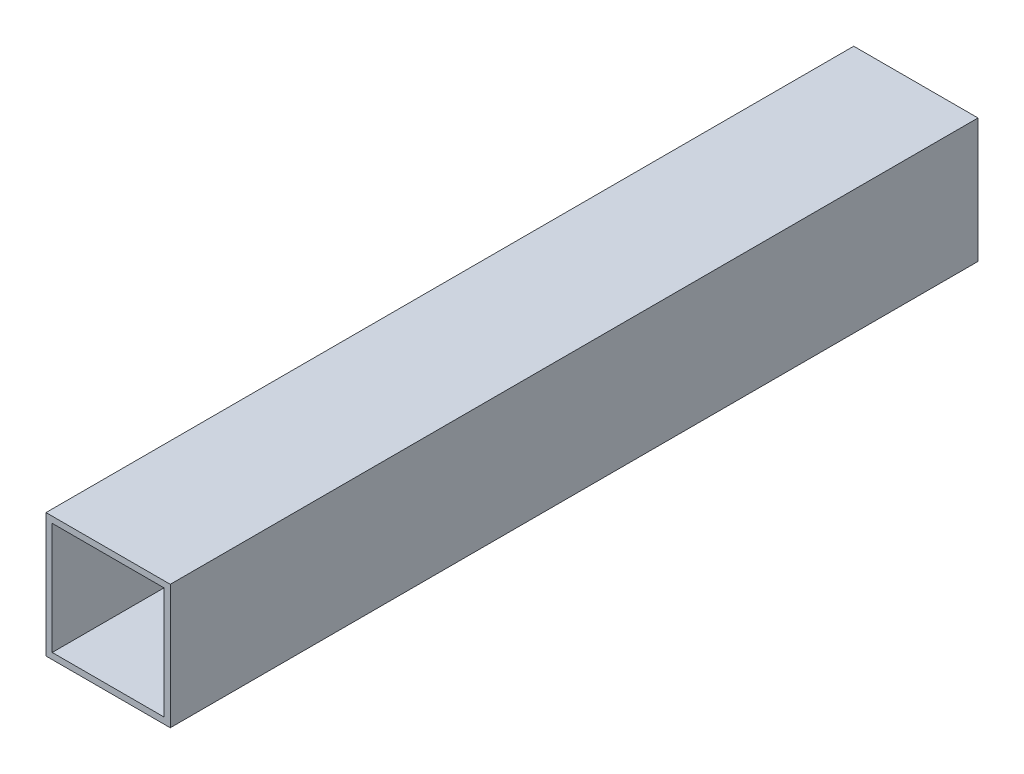
ISO-10303-21;
HEADER;
FILE_DESCRIPTION(('STEP AP214'),'2;1');
FILE_NAME('part.step','',(''),(''),'','','');
FILE_SCHEMA(('AUTOMOTIVE_DESIGN { 1 0 10303 214 1 1 1 1 }'));
ENDSEC;
DATA;
#1=APPLICATION_CONTEXT('core data for automotive mechanical design processes');
#2=APPLICATION_PROTOCOL_DEFINITION('international standard','automotive_design',2000,#1);
#3=PRODUCT_CONTEXT('',#1,'mechanical');
#4=PRODUCT('Part','Part','',(#3));
#5=PRODUCT_RELATED_PRODUCT_CATEGORY('part','',(#4));
#6=PRODUCT_DEFINITION_FORMATION('','',#4);
#7=PRODUCT_DEFINITION_CONTEXT('part definition',#1,'design');
#8=PRODUCT_DEFINITION('design','',#6,#7);
#9=PRODUCT_DEFINITION_SHAPE('','',#8);
#10=(LENGTH_UNIT() NAMED_UNIT(*) SI_UNIT(.MILLI.,.METRE.));
#11=(NAMED_UNIT(*) PLANE_ANGLE_UNIT() SI_UNIT($,.RADIAN.));
#12=(NAMED_UNIT(*) SI_UNIT($,.STERADIAN.) SOLID_ANGLE_UNIT());
#13=UNCERTAINTY_MEASURE_WITH_UNIT(LENGTH_MEASURE(1.E-05),#10,'distance_accuracy_value','');
#14=(GEOMETRIC_REPRESENTATION_CONTEXT(3) GLOBAL_UNCERTAINTY_ASSIGNED_CONTEXT((#13)) GLOBAL_UNIT_ASSIGNED_CONTEXT((#10,
#11,#12)) REPRESENTATION_CONTEXT('',''));
#15=CARTESIAN_POINT('',(0.,0.,0.));
#16=DIRECTION('',(0.,0.,1.));
#17=DIRECTION('',(1.,0.,0.));
#18=AXIS2_PLACEMENT_3D('',#15,#16,#17);
#19=CARTESIAN_POINT('',(0.,0.,325.));
#20=DIRECTION('',(0.,0.,-1.));
#21=DIRECTION('',(-1.,0.,0.));
#22=AXIS2_PLACEMENT_3D('',#19,#20,#21);
#23=PLANE('',#22);
#24=DIRECTION('',(0.,-1.,0.));
#25=VECTOR('',#24,1.);
#26=CARTESIAN_POINT('',(-50.,-50.,325.));
#27=LINE('',#26,#25);
#28=CARTESIAN_POINT('',(-50.,49.9999999999999,325.));
#29=VERTEX_POINT('',#28);
#30=CARTESIAN_POINT('',(-50.,-50.,325.));
#31=VERTEX_POINT('',#30);
#32=EDGE_CURVE('E133',#29,#31,#27,.T.);
#33=ORIENTED_EDGE('',*,*,#32,.T.);
#34=DIRECTION('',(1.,0.,0.));
#35=VECTOR('',#34,1.);
#36=CARTESIAN_POINT('',(-50.,-50.,325.));
#37=LINE('',#36,#35);
#38=CARTESIAN_POINT('',(50.,-50.,325.));
#39=VERTEX_POINT('',#38);
#40=EDGE_CURVE('E136',#31,#39,#37,.T.);
#41=ORIENTED_EDGE('',*,*,#40,.T.);
#42=DIRECTION('',(0.,1.,0.));
#43=VECTOR('',#42,1.);
#44=CARTESIAN_POINT('',(50.,-50.,325.));
#45=LINE('',#44,#43);
#46=CARTESIAN_POINT('',(49.9999999999999,49.9999999999999,325.));
#47=VERTEX_POINT('',#46);
#48=EDGE_CURVE('E139',#39,#47,#45,.T.);
#49=ORIENTED_EDGE('',*,*,#48,.T.);
#50=DIRECTION('',(-1.,0.,0.));
#51=VECTOR('',#50,1.);
#52=CARTESIAN_POINT('',(-50.,49.9999999999999,325.));
#53=LINE('',#52,#51);
#54=EDGE_CURVE('E141',#47,#29,#53,.T.);
#55=ORIENTED_EDGE('',*,*,#54,.T.);
#56=EDGE_LOOP('',(#33,#41,#49,#55));
#57=FACE_BOUND('',#56,.T.);
#58=DIRECTION('',(0.,-1.,0.));
#59=VECTOR('',#58,1.);
#60=CARTESIAN_POINT('',(-45.,-45.,325.));
#61=LINE('',#60,#59);
#62=CARTESIAN_POINT('',(-45.,44.9999999999999,325.));
#63=VERTEX_POINT('',#62);
#64=CARTESIAN_POINT('',(-45.,-45.,325.));
#65=VERTEX_POINT('',#64);
#66=EDGE_CURVE('E97',#63,#65,#61,.T.);
#67=ORIENTED_EDGE('',*,*,#66,.F.);
#68=DIRECTION('',(-1.,0.,0.));
#69=VECTOR('',#68,1.);
#70=CARTESIAN_POINT('',(-45.,44.9999999999999,325.));
#71=LINE('',#70,#69);
#72=CARTESIAN_POINT('',(45.,44.9999999999999,325.));
#73=VERTEX_POINT('',#72);
#74=EDGE_CURVE('E119',#73,#63,#71,.T.);
#75=ORIENTED_EDGE('',*,*,#74,.F.);
#76=DIRECTION('',(0.,1.,0.));
#77=VECTOR('',#76,1.);
#78=CARTESIAN_POINT('',(45.,-45.,325.));
#79=LINE('',#78,#77);
#80=CARTESIAN_POINT('',(45.,-45.,325.));
#81=VERTEX_POINT('',#80);
#82=EDGE_CURVE('E117',#81,#73,#79,.T.);
#83=ORIENTED_EDGE('',*,*,#82,.F.);
#84=DIRECTION('',(1.,0.,0.));
#85=VECTOR('',#84,1.);
#86=CARTESIAN_POINT('',(-45.,-45.,325.));
#87=LINE('',#86,#85);
#88=EDGE_CURVE('E105',#65,#81,#87,.T.);
#89=ORIENTED_EDGE('',*,*,#88,.F.);
#90=EDGE_LOOP('',(#67,#75,#83,#89));
#91=FACE_BOUND('',#90,.T.);
#92=ADVANCED_FACE('F32',(#57,#91),#23,.F.);
#93=CARTESIAN_POINT('',(0.,0.,-325.));
#94=DIRECTION('',(0.,0.,-1.));
#95=DIRECTION('',(-1.,0.,0.));
#96=AXIS2_PLACEMENT_3D('',#93,#94,#95);
#97=PLANE('',#96);
#98=DIRECTION('',(0.,-1.,0.));
#99=VECTOR('',#98,1.);
#100=CARTESIAN_POINT('',(-50.,-50.,-325.));
#101=LINE('',#100,#99);
#102=CARTESIAN_POINT('',(-50.,49.9999999999999,-325.));
#103=VERTEX_POINT('',#102);
#104=CARTESIAN_POINT('',(-50.,-50.,-325.));
#105=VERTEX_POINT('',#104);
#106=EDGE_CURVE('E113',#103,#105,#101,.T.);
#107=ORIENTED_EDGE('',*,*,#106,.F.);
#108=DIRECTION('',(-1.,0.,0.));
#109=VECTOR('',#108,1.);
#110=CARTESIAN_POINT('',(-50.,49.9999999999999,-325.));
#111=LINE('',#110,#109);
#112=CARTESIAN_POINT('',(49.9999999999999,49.9999999999999,-325.));
#113=VERTEX_POINT('',#112);
#114=EDGE_CURVE('E137',#113,#103,#111,.T.);
#115=ORIENTED_EDGE('',*,*,#114,.F.);
#116=DIRECTION('',(0.,1.,0.));
#117=VECTOR('',#116,1.);
#118=CARTESIAN_POINT('',(50.,-50.,-325.));
#119=LINE('',#118,#117);
#120=CARTESIAN_POINT('',(50.,-50.,-325.));
#121=VERTEX_POINT('',#120);
#122=EDGE_CURVE('E148',#121,#113,#119,.T.);
#123=ORIENTED_EDGE('',*,*,#122,.F.);
#124=DIRECTION('',(1.,0.,0.));
#125=VECTOR('',#124,1.);
#126=CARTESIAN_POINT('',(-50.,-50.,-325.));
#127=LINE('',#126,#125);
#128=EDGE_CURVE('E146',#105,#121,#127,.T.);
#129=ORIENTED_EDGE('',*,*,#128,.F.);
#130=EDGE_LOOP('',(#107,#115,#123,#129));
#131=FACE_BOUND('',#130,.T.);
#132=DIRECTION('',(-1.,0.,0.));
#133=VECTOR('',#132,1.);
#134=CARTESIAN_POINT('',(-45.,44.9999999999999,-325.));
#135=LINE('',#134,#133);
#136=CARTESIAN_POINT('',(45.,44.9999999999999,-325.));
#137=VERTEX_POINT('',#136);
#138=CARTESIAN_POINT('',(-45.,44.9999999999999,-325.));
#139=VERTEX_POINT('',#138);
#140=EDGE_CURVE('E106',#137,#139,#135,.T.);
#141=ORIENTED_EDGE('',*,*,#140,.T.);
#142=DIRECTION('',(0.,-1.,0.));
#143=VECTOR('',#142,1.);
#144=CARTESIAN_POINT('',(-45.,-45.,-325.));
#145=LINE('',#144,#143);
#146=CARTESIAN_POINT('',(-45.,-45.,-325.));
#147=VERTEX_POINT('',#146);
#148=EDGE_CURVE('E55',#139,#147,#145,.T.);
#149=ORIENTED_EDGE('',*,*,#148,.T.);
#150=DIRECTION('',(1.,0.,0.));
#151=VECTOR('',#150,1.);
#152=CARTESIAN_POINT('',(-45.,-45.,-325.));
#153=LINE('',#152,#151);
#154=CARTESIAN_POINT('',(45.,-45.,-325.));
#155=VERTEX_POINT('',#154);
#156=EDGE_CURVE('E112',#147,#155,#153,.T.);
#157=ORIENTED_EDGE('',*,*,#156,.T.);
#158=DIRECTION('',(0.,1.,0.));
#159=VECTOR('',#158,1.);
#160=CARTESIAN_POINT('',(45.,-45.,-325.));
#161=LINE('',#160,#159);
#162=EDGE_CURVE('E125',#155,#137,#161,.T.);
#163=ORIENTED_EDGE('',*,*,#162,.T.);
#164=EDGE_LOOP('',(#141,#149,#157,#163));
#165=FACE_BOUND('',#164,.T.);
#166=ADVANCED_FACE('F166',(#131,#165),#97,.T.);
#167=CARTESIAN_POINT('',(-50.,-50.,325.));
#168=DIRECTION('',(1.,0.,0.));
#169=DIRECTION('',(0.,0.,-1.));
#170=AXIS2_PLACEMENT_3D('',#167,#168,#169);
#171=PLANE('',#170);
#172=ORIENTED_EDGE('',*,*,#106,.T.);
#173=DIRECTION('',(0.,0.,-1.));
#174=VECTOR('',#173,1.);
#175=CARTESIAN_POINT('',(-50.,-50.,325.));
#176=LINE('',#175,#174);
#177=EDGE_CURVE('E11',#31,#105,#176,.T.);
#178=ORIENTED_EDGE('',*,*,#177,.F.);
#179=ORIENTED_EDGE('',*,*,#32,.F.);
#180=DIRECTION('',(0.,0.,-1.));
#181=VECTOR('',#180,1.);
#182=CARTESIAN_POINT('',(-50.,49.9999999999999,325.));
#183=LINE('',#182,#181);
#184=EDGE_CURVE('E143',#29,#103,#183,.T.);
#185=ORIENTED_EDGE('',*,*,#184,.T.);
#186=EDGE_LOOP('',(#172,#178,#179,#185));
#187=FACE_BOUND('',#186,.T.);
#188=ADVANCED_FACE('F34',(#187),#171,.F.);
#189=CARTESIAN_POINT('',(-50.,-50.,325.));
#190=DIRECTION('',(0.,1.,0.));
#191=DIRECTION('',(0.,0.,1.));
#192=AXIS2_PLACEMENT_3D('',#189,#190,#191);
#193=PLANE('',#192);
#194=ORIENTED_EDGE('',*,*,#128,.T.);
#195=DIRECTION('',(0.,0.,-1.));
#196=VECTOR('',#195,1.);
#197=CARTESIAN_POINT('',(50.,-50.,325.));
#198=LINE('',#197,#196);
#199=EDGE_CURVE('E40',#39,#121,#198,.T.);
#200=ORIENTED_EDGE('',*,*,#199,.F.);
#201=ORIENTED_EDGE('',*,*,#40,.F.);
#202=ORIENTED_EDGE('',*,*,#177,.T.);
#203=EDGE_LOOP('',(#194,#200,#201,#202));
#204=FACE_BOUND('',#203,.T.);
#205=ADVANCED_FACE('F176',(#204),#193,.F.);
#206=CARTESIAN_POINT('',(50.,-50.,325.));
#207=DIRECTION('',(-1.,0.,0.));
#208=DIRECTION('',(0.,-1.,0.));
#209=AXIS2_PLACEMENT_3D('',#206,#207,#208);
#210=PLANE('',#209);
#211=ORIENTED_EDGE('',*,*,#122,.T.);
#212=DIRECTION('',(0.,0.,-1.));
#213=VECTOR('',#212,1.);
#214=CARTESIAN_POINT('',(49.9999999999999,49.9999999999999,325.));
#215=LINE('',#214,#213);
#216=EDGE_CURVE('E153',#47,#113,#215,.T.);
#217=ORIENTED_EDGE('',*,*,#216,.F.);
#218=ORIENTED_EDGE('',*,*,#48,.F.);
#219=ORIENTED_EDGE('',*,*,#199,.T.);
#220=EDGE_LOOP('',(#211,#217,#218,#219));
#221=FACE_BOUND('',#220,.T.);
#222=ADVANCED_FACE('F160',(#221),#210,.F.);
#223=CARTESIAN_POINT('',(-50.,49.9999999999999,325.));
#224=DIRECTION('',(0.,-1.,0.));
#225=DIRECTION('',(0.,0.,-1.));
#226=AXIS2_PLACEMENT_3D('',#223,#224,#225);
#227=PLANE('',#226);
#228=ORIENTED_EDGE('',*,*,#114,.T.);
#229=ORIENTED_EDGE('',*,*,#184,.F.);
#230=ORIENTED_EDGE('',*,*,#54,.F.);
#231=ORIENTED_EDGE('',*,*,#216,.T.);
#232=EDGE_LOOP('',(#228,#229,#230,#231));
#233=FACE_BOUND('',#232,.T.);
#234=ADVANCED_FACE('F170',(#233),#227,.F.);
#235=CARTESIAN_POINT('',(-45.,-45.,325.));
#236=DIRECTION('',(1.,0.,0.));
#237=DIRECTION('',(0.,0.,-1.));
#238=AXIS2_PLACEMENT_3D('',#235,#236,#237);
#239=PLANE('',#238);
#240=ORIENTED_EDGE('',*,*,#148,.F.);
#241=DIRECTION('',(0.,0.,-1.));
#242=VECTOR('',#241,1.);
#243=CARTESIAN_POINT('',(-45.,44.9999999999999,325.));
#244=LINE('',#243,#242);
#245=EDGE_CURVE('E101',#63,#139,#244,.T.);
#246=ORIENTED_EDGE('',*,*,#245,.F.);
#247=ORIENTED_EDGE('',*,*,#66,.T.);
#248=DIRECTION('',(0.,0.,-1.));
#249=VECTOR('',#248,1.);
#250=CARTESIAN_POINT('',(-45.,-45.,325.));
#251=LINE('',#250,#249);
#252=EDGE_CURVE('E100',#65,#147,#251,.T.);
#253=ORIENTED_EDGE('',*,*,#252,.T.);
#254=EDGE_LOOP('',(#240,#246,#247,#253));
#255=FACE_BOUND('',#254,.T.);
#256=ADVANCED_FACE('F99',(#255),#239,.T.);
#257=CARTESIAN_POINT('',(-45.,-45.,325.));
#258=DIRECTION('',(0.,1.,0.));
#259=DIRECTION('',(0.,0.,1.));
#260=AXIS2_PLACEMENT_3D('',#257,#258,#259);
#261=PLANE('',#260);
#262=ORIENTED_EDGE('',*,*,#156,.F.);
#263=ORIENTED_EDGE('',*,*,#252,.F.);
#264=ORIENTED_EDGE('',*,*,#88,.T.);
#265=DIRECTION('',(0.,0.,-1.));
#266=VECTOR('',#265,1.);
#267=CARTESIAN_POINT('',(45.,-45.,325.));
#268=LINE('',#267,#266);
#269=EDGE_CURVE('E114',#81,#155,#268,.T.);
#270=ORIENTED_EDGE('',*,*,#269,.T.);
#271=EDGE_LOOP('',(#262,#263,#264,#270));
#272=FACE_BOUND('',#271,.T.);
#273=ADVANCED_FACE('F109',(#272),#261,.T.);
#274=CARTESIAN_POINT('',(45.,-45.,325.));
#275=DIRECTION('',(-1.,0.,0.));
#276=DIRECTION('',(0.,-1.,0.));
#277=AXIS2_PLACEMENT_3D('',#274,#275,#276);
#278=PLANE('',#277);
#279=ORIENTED_EDGE('',*,*,#162,.F.);
#280=ORIENTED_EDGE('',*,*,#269,.F.);
#281=ORIENTED_EDGE('',*,*,#82,.T.);
#282=DIRECTION('',(0.,0.,-1.));
#283=VECTOR('',#282,1.);
#284=CARTESIAN_POINT('',(45.,44.9999999999999,325.));
#285=LINE('',#284,#283);
#286=EDGE_CURVE('E47',#73,#137,#285,.T.);
#287=ORIENTED_EDGE('',*,*,#286,.T.);
#288=EDGE_LOOP('',(#279,#280,#281,#287));
#289=FACE_BOUND('',#288,.T.);
#290=ADVANCED_FACE('F199',(#289),#278,.T.);
#291=CARTESIAN_POINT('',(-45.,44.9999999999999,325.));
#292=DIRECTION('',(0.,-1.,0.));
#293=DIRECTION('',(0.,0.,-1.));
#294=AXIS2_PLACEMENT_3D('',#291,#292,#293);
#295=PLANE('',#294);
#296=ORIENTED_EDGE('',*,*,#140,.F.);
#297=ORIENTED_EDGE('',*,*,#286,.F.);
#298=ORIENTED_EDGE('',*,*,#74,.T.);
#299=ORIENTED_EDGE('',*,*,#245,.T.);
#300=EDGE_LOOP('',(#296,#297,#298,#299));
#301=FACE_BOUND('',#300,.T.);
#302=ADVANCED_FACE('F203',(#301),#295,.T.);
#303=CLOSED_SHELL('',(#92,#166,#188,#205,#222,#234,#256,#273,#290,#302));
#304=MANIFOLD_SOLID_BREP('B2',#303);
#305=ADVANCED_BREP_SHAPE_REPRESENTATION('',(#18,#304),#14);
#306=SHAPE_DEFINITION_REPRESENTATION(#9,#305);
ENDSEC;
END-ISO-10303-21;
